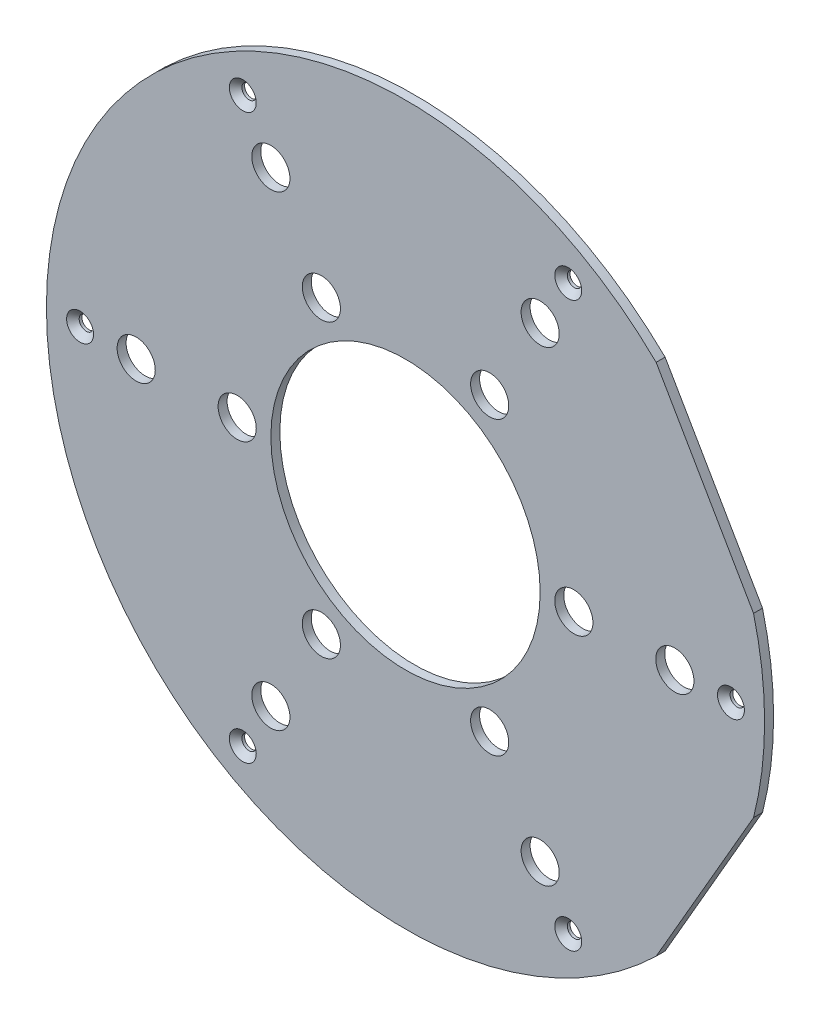
ISO-10303-21;
HEADER;
FILE_DESCRIPTION(('STEP AP214'),'2;1');
FILE_NAME('part.step','',(''),(''),'','','');
FILE_SCHEMA(('AUTOMOTIVE_DESIGN { 1 0 10303 214 1 1 1 1 }'));
ENDSEC;
DATA;
#1=APPLICATION_CONTEXT('core data for automotive mechanical design processes');
#2=APPLICATION_PROTOCOL_DEFINITION('international standard','automotive_design',2000,#1);
#3=PRODUCT_CONTEXT('',#1,'mechanical');
#4=PRODUCT('Part','Part','',(#3));
#5=PRODUCT_RELATED_PRODUCT_CATEGORY('part','',(#4));
#6=PRODUCT_DEFINITION_FORMATION('','',#4);
#7=PRODUCT_DEFINITION_CONTEXT('part definition',#1,'design');
#8=PRODUCT_DEFINITION('design','',#6,#7);
#9=PRODUCT_DEFINITION_SHAPE('','',#8);
#10=(LENGTH_UNIT() NAMED_UNIT(*) SI_UNIT(.MILLI.,.METRE.));
#11=(NAMED_UNIT(*) PLANE_ANGLE_UNIT() SI_UNIT($,.RADIAN.));
#12=(NAMED_UNIT(*) SI_UNIT($,.STERADIAN.) SOLID_ANGLE_UNIT());
#13=UNCERTAINTY_MEASURE_WITH_UNIT(LENGTH_MEASURE(1.E-05),#10,'distance_accuracy_value','');
#14=(GEOMETRIC_REPRESENTATION_CONTEXT(3) GLOBAL_UNCERTAINTY_ASSIGNED_CONTEXT((#13)) GLOBAL_UNIT_ASSIGNED_CONTEXT((#10,
#11,#12)) REPRESENTATION_CONTEXT('',''));
#15=CARTESIAN_POINT('',(0.,0.,0.));
#16=DIRECTION('',(0.,0.,1.));
#17=DIRECTION('',(1.,0.,0.));
#18=AXIS2_PLACEMENT_3D('',#15,#16,#17);
#19=CARTESIAN_POINT('',(36.25,-62.7868417743718,1.3));
#20=DIRECTION('',(0.,0.,1.));
#21=DIRECTION('',(1.,0.,0.));
#22=AXIS2_PLACEMENT_3D('',#19,#20,#21);
#23=CONICAL_SURFACE('',#22,2.3,0.7853981625);
#24=CARTESIAN_POINT('',(36.25,-62.7868417743718,2.));
#25=DIRECTION('',(0.,0.,-1.));
#26=DIRECTION('',(1.,0.,0.));
#27=AXIS2_PLACEMENT_3D('',#24,#25,#26);
#28=CIRCLE('',#27,3.);
#29=CARTESIAN_POINT('',(39.25,-62.7868417743718,2.));
#30=VERTEX_POINT('',#29);
#31=EDGE_CURVE('E545',#30,#30,#28,.T.);
#32=ORIENTED_EDGE('',*,*,#31,.F.);
#33=EDGE_LOOP('',(#32));
#34=FACE_BOUND('',#33,.T.);
#35=CARTESIAN_POINT('',(36.25,-62.7868417743718,0.599999999999994));
#36=DIRECTION('',(0.,0.,1.));
#37=DIRECTION('',(1.,0.,0.));
#38=AXIS2_PLACEMENT_3D('',#35,#36,#37);
#39=CIRCLE('',#38,1.6);
#40=CARTESIAN_POINT('',(37.8499999999999,-62.7868417743718,0.599999999999994));
#41=VERTEX_POINT('',#40);
#42=EDGE_CURVE('E11',#41,#41,#39,.T.);
#43=ORIENTED_EDGE('',*,*,#42,.F.);
#44=EDGE_LOOP('',(#43));
#45=FACE_BOUND('',#44,.T.);
#46=ADVANCED_FACE('F17',(#34,#45),#23,.F.);
#47=CARTESIAN_POINT('',(36.25,-62.7868417743718,-224.283008641833));
#48=DIRECTION('',(0.,0.,1.));
#49=DIRECTION('',(1.,0.,0.));
#50=AXIS2_PLACEMENT_3D('',#47,#48,#49);
#51=CYLINDRICAL_SURFACE('',#50,1.6);
#52=CARTESIAN_POINT('',(36.25,-62.7868417743718,0.));
#53=DIRECTION('',(0.,0.,1.));
#54=DIRECTION('',(1.,0.,0.));
#55=AXIS2_PLACEMENT_3D('',#52,#53,#54);
#56=CIRCLE('',#55,1.6);
#57=CARTESIAN_POINT('',(37.8499999999999,-62.7868417743718,0.));
#58=VERTEX_POINT('',#57);
#59=EDGE_CURVE('E81',#58,#58,#56,.T.);
#60=ORIENTED_EDGE('',*,*,#59,.F.);
#61=EDGE_LOOP('',(#60));
#62=FACE_BOUND('',#61,.T.);
#63=ORIENTED_EDGE('',*,*,#42,.T.);
#64=EDGE_LOOP('',(#63));
#65=FACE_BOUND('',#64,.T.);
#66=ADVANCED_FACE('F254',(#62,#65),#51,.F.);
#67=CARTESIAN_POINT('',(-36.25,-62.7868417743718,1.3));
#68=DIRECTION('',(0.,0.,1.));
#69=DIRECTION('',(1.,0.,0.));
#70=AXIS2_PLACEMENT_3D('',#67,#68,#69);
#71=CONICAL_SURFACE('',#70,2.3,0.7853981625);
#72=CARTESIAN_POINT('',(-36.25,-62.7868417743718,2.));
#73=DIRECTION('',(0.,0.,-1.));
#74=DIRECTION('',(1.,0.,0.));
#75=AXIS2_PLACEMENT_3D('',#72,#73,#74);
#76=CIRCLE('',#75,3.);
#77=CARTESIAN_POINT('',(-33.25,-62.7868417743718,2.));
#78=VERTEX_POINT('',#77);
#79=EDGE_CURVE('E587',#78,#78,#76,.T.);
#80=ORIENTED_EDGE('',*,*,#79,.F.);
#81=EDGE_LOOP('',(#80));
#82=FACE_BOUND('',#81,.T.);
#83=CARTESIAN_POINT('',(-36.25,-62.7868417743718,0.599999999999994));
#84=DIRECTION('',(0.,0.,1.));
#85=DIRECTION('',(1.,0.,0.));
#86=AXIS2_PLACEMENT_3D('',#83,#84,#85);
#87=CIRCLE('',#86,1.6);
#88=CARTESIAN_POINT('',(-34.65,-62.7868417743718,0.599999999999994));
#89=VERTEX_POINT('',#88);
#90=EDGE_CURVE('E27',#89,#89,#87,.T.);
#91=ORIENTED_EDGE('',*,*,#90,.F.);
#92=EDGE_LOOP('',(#91));
#93=FACE_BOUND('',#92,.T.);
#94=ADVANCED_FACE('F260',(#82,#93),#71,.F.);
#95=CARTESIAN_POINT('',(-36.25,-62.7868417743718,-224.283008641833));
#96=DIRECTION('',(0.,0.,1.));
#97=DIRECTION('',(1.,0.,0.));
#98=AXIS2_PLACEMENT_3D('',#95,#96,#97);
#99=CYLINDRICAL_SURFACE('',#98,1.6);
#100=CARTESIAN_POINT('',(-36.25,-62.7868417743718,0.));
#101=DIRECTION('',(0.,0.,1.));
#102=DIRECTION('',(1.,0.,0.));
#103=AXIS2_PLACEMENT_3D('',#100,#101,#102);
#104=CIRCLE('',#103,1.6);
#105=CARTESIAN_POINT('',(-34.65,-62.7868417743718,0.));
#106=VERTEX_POINT('',#105);
#107=EDGE_CURVE('E84',#106,#106,#104,.T.);
#108=ORIENTED_EDGE('',*,*,#107,.F.);
#109=EDGE_LOOP('',(#108));
#110=FACE_BOUND('',#109,.T.);
#111=ORIENTED_EDGE('',*,*,#90,.T.);
#112=EDGE_LOOP('',(#111));
#113=FACE_BOUND('',#112,.T.);
#114=ADVANCED_FACE('F268',(#110,#113),#99,.F.);
#115=CARTESIAN_POINT('',(-72.5,0.,1.3));
#116=DIRECTION('',(0.,0.,1.));
#117=DIRECTION('',(1.,0.,0.));
#118=AXIS2_PLACEMENT_3D('',#115,#116,#117);
#119=CONICAL_SURFACE('',#118,2.3,0.7853981625);
#120=CARTESIAN_POINT('',(-72.5,0.,2.));
#121=DIRECTION('',(0.,0.,-1.));
#122=DIRECTION('',(1.,0.,0.));
#123=AXIS2_PLACEMENT_3D('',#120,#121,#122);
#124=CIRCLE('',#123,3.);
#125=CARTESIAN_POINT('',(-69.5,0.,2.));
#126=VERTEX_POINT('',#125);
#127=EDGE_CURVE('E580',#126,#126,#124,.T.);
#128=ORIENTED_EDGE('',*,*,#127,.F.);
#129=EDGE_LOOP('',(#128));
#130=FACE_BOUND('',#129,.T.);
#131=CARTESIAN_POINT('',(-72.5,0.,0.599999999999994));
#132=DIRECTION('',(0.,0.,1.));
#133=DIRECTION('',(1.,0.,0.));
#134=AXIS2_PLACEMENT_3D('',#131,#132,#133);
#135=CIRCLE('',#134,1.6);
#136=CARTESIAN_POINT('',(-70.9,0.,0.599999999999994));
#137=VERTEX_POINT('',#136);
#138=EDGE_CURVE('E577',#137,#137,#135,.T.);
#139=ORIENTED_EDGE('',*,*,#138,.F.);
#140=EDGE_LOOP('',(#139));
#141=FACE_BOUND('',#140,.T.);
#142=ADVANCED_FACE('F272',(#130,#141),#119,.F.);
#143=CARTESIAN_POINT('',(-72.5,0.,-224.283008641833));
#144=DIRECTION('',(0.,0.,1.));
#145=DIRECTION('',(1.,0.,0.));
#146=AXIS2_PLACEMENT_3D('',#143,#144,#145);
#147=CYLINDRICAL_SURFACE('',#146,1.6);
#148=CARTESIAN_POINT('',(-72.5,0.,0.));
#149=DIRECTION('',(0.,0.,1.));
#150=DIRECTION('',(1.,0.,0.));
#151=AXIS2_PLACEMENT_3D('',#148,#149,#150);
#152=CIRCLE('',#151,1.6);
#153=CARTESIAN_POINT('',(-70.9,0.,0.));
#154=VERTEX_POINT('',#153);
#155=EDGE_CURVE('E574',#154,#154,#152,.T.);
#156=ORIENTED_EDGE('',*,*,#155,.F.);
#157=EDGE_LOOP('',(#156));
#158=FACE_BOUND('',#157,.T.);
#159=ORIENTED_EDGE('',*,*,#138,.T.);
#160=EDGE_LOOP('',(#159));
#161=FACE_BOUND('',#160,.T.);
#162=ADVANCED_FACE('F276',(#158,#161),#147,.F.);
#163=CARTESIAN_POINT('',(-36.25,62.7868417743718,1.3));
#164=DIRECTION('',(0.,0.,1.));
#165=DIRECTION('',(1.,0.,0.));
#166=AXIS2_PLACEMENT_3D('',#163,#164,#165);
#167=CONICAL_SURFACE('',#166,2.3,0.7853981625);
#168=CARTESIAN_POINT('',(-36.25,62.7868417743718,2.));
#169=DIRECTION('',(0.,0.,-1.));
#170=DIRECTION('',(1.,0.,0.));
#171=AXIS2_PLACEMENT_3D('',#168,#169,#170);
#172=CIRCLE('',#171,3.);
#173=CARTESIAN_POINT('',(-33.25,62.7868417743718,2.));
#174=VERTEX_POINT('',#173);
#175=EDGE_CURVE('E571',#174,#174,#172,.T.);
#176=ORIENTED_EDGE('',*,*,#175,.F.);
#177=EDGE_LOOP('',(#176));
#178=FACE_BOUND('',#177,.T.);
#179=CARTESIAN_POINT('',(-36.25,62.7868417743718,0.599999999999994));
#180=DIRECTION('',(0.,0.,1.));
#181=DIRECTION('',(1.,0.,0.));
#182=AXIS2_PLACEMENT_3D('',#179,#180,#181);
#183=CIRCLE('',#182,1.6);
#184=CARTESIAN_POINT('',(-34.65,62.7868417743718,0.599999999999994));
#185=VERTEX_POINT('',#184);
#186=EDGE_CURVE('E568',#185,#185,#183,.T.);
#187=ORIENTED_EDGE('',*,*,#186,.F.);
#188=EDGE_LOOP('',(#187));
#189=FACE_BOUND('',#188,.T.);
#190=ADVANCED_FACE('F280',(#178,#189),#167,.F.);
#191=CARTESIAN_POINT('',(-36.25,62.7868417743718,-224.283008641833));
#192=DIRECTION('',(0.,0.,1.));
#193=DIRECTION('',(1.,0.,0.));
#194=AXIS2_PLACEMENT_3D('',#191,#192,#193);
#195=CYLINDRICAL_SURFACE('',#194,1.6);
#196=CARTESIAN_POINT('',(-36.25,62.7868417743718,0.));
#197=DIRECTION('',(0.,0.,1.));
#198=DIRECTION('',(1.,0.,0.));
#199=AXIS2_PLACEMENT_3D('',#196,#197,#198);
#200=CIRCLE('',#199,1.6);
#201=CARTESIAN_POINT('',(-34.65,62.7868417743718,0.));
#202=VERTEX_POINT('',#201);
#203=EDGE_CURVE('E565',#202,#202,#200,.T.);
#204=ORIENTED_EDGE('',*,*,#203,.F.);
#205=EDGE_LOOP('',(#204));
#206=FACE_BOUND('',#205,.T.);
#207=ORIENTED_EDGE('',*,*,#186,.T.);
#208=EDGE_LOOP('',(#207));
#209=FACE_BOUND('',#208,.T.);
#210=ADVANCED_FACE('F284',(#206,#209),#195,.F.);
#211=CARTESIAN_POINT('',(36.25,62.7868417743718,1.3));
#212=DIRECTION('',(0.,0.,1.));
#213=DIRECTION('',(1.,0.,0.));
#214=AXIS2_PLACEMENT_3D('',#211,#212,#213);
#215=CONICAL_SURFACE('',#214,2.3,0.7853981625);
#216=CARTESIAN_POINT('',(36.25,62.7868417743718,2.));
#217=DIRECTION('',(0.,0.,-1.));
#218=DIRECTION('',(1.,0.,0.));
#219=AXIS2_PLACEMENT_3D('',#216,#217,#218);
#220=CIRCLE('',#219,3.);
#221=CARTESIAN_POINT('',(39.25,62.7868417743718,2.));
#222=VERTEX_POINT('',#221);
#223=EDGE_CURVE('E562',#222,#222,#220,.T.);
#224=ORIENTED_EDGE('',*,*,#223,.F.);
#225=EDGE_LOOP('',(#224));
#226=FACE_BOUND('',#225,.T.);
#227=CARTESIAN_POINT('',(36.25,62.7868417743718,0.599999999999994));
#228=DIRECTION('',(0.,0.,1.));
#229=DIRECTION('',(1.,0.,0.));
#230=AXIS2_PLACEMENT_3D('',#227,#228,#229);
#231=CIRCLE('',#230,1.6);
#232=CARTESIAN_POINT('',(37.85,62.7868417743718,0.599999999999994));
#233=VERTEX_POINT('',#232);
#234=EDGE_CURVE('E559',#233,#233,#231,.T.);
#235=ORIENTED_EDGE('',*,*,#234,.F.);
#236=EDGE_LOOP('',(#235));
#237=FACE_BOUND('',#236,.T.);
#238=ADVANCED_FACE('F288',(#226,#237),#215,.F.);
#239=CARTESIAN_POINT('',(36.25,62.7868417743718,-224.283008641833));
#240=DIRECTION('',(0.,0.,1.));
#241=DIRECTION('',(1.,0.,0.));
#242=AXIS2_PLACEMENT_3D('',#239,#240,#241);
#243=CYLINDRICAL_SURFACE('',#242,1.6);
#244=CARTESIAN_POINT('',(36.25,62.7868417743718,0.));
#245=DIRECTION('',(0.,0.,1.));
#246=DIRECTION('',(1.,0.,0.));
#247=AXIS2_PLACEMENT_3D('',#244,#245,#246);
#248=CIRCLE('',#247,1.6);
#249=CARTESIAN_POINT('',(37.85,62.7868417743718,0.));
#250=VERTEX_POINT('',#249);
#251=EDGE_CURVE('E556',#250,#250,#248,.T.);
#252=ORIENTED_EDGE('',*,*,#251,.F.);
#253=EDGE_LOOP('',(#252));
#254=FACE_BOUND('',#253,.T.);
#255=ORIENTED_EDGE('',*,*,#234,.T.);
#256=EDGE_LOOP('',(#255));
#257=FACE_BOUND('',#256,.T.);
#258=ADVANCED_FACE('F292',(#254,#257),#243,.F.);
#259=CARTESIAN_POINT('',(72.5,0.,1.3));
#260=DIRECTION('',(0.,0.,1.));
#261=DIRECTION('',(1.,0.,0.));
#262=AXIS2_PLACEMENT_3D('',#259,#260,#261);
#263=CONICAL_SURFACE('',#262,2.3,0.7853981625);
#264=CARTESIAN_POINT('',(72.5,0.,2.));
#265=DIRECTION('',(0.,0.,-1.));
#266=DIRECTION('',(1.,0.,0.));
#267=AXIS2_PLACEMENT_3D('',#264,#265,#266);
#268=CIRCLE('',#267,3.);
#269=CARTESIAN_POINT('',(75.5,0.,2.));
#270=VERTEX_POINT('',#269);
#271=EDGE_CURVE('E137',#270,#270,#268,.T.);
#272=ORIENTED_EDGE('',*,*,#271,.F.);
#273=EDGE_LOOP('',(#272));
#274=FACE_BOUND('',#273,.T.);
#275=CARTESIAN_POINT('',(72.5,0.,0.599999999999994));
#276=DIRECTION('',(0.,0.,1.));
#277=DIRECTION('',(1.,0.,0.));
#278=AXIS2_PLACEMENT_3D('',#275,#276,#277);
#279=CIRCLE('',#278,1.6);
#280=CARTESIAN_POINT('',(74.1,0.,0.599999999999994));
#281=VERTEX_POINT('',#280);
#282=EDGE_CURVE('E551',#281,#281,#279,.T.);
#283=ORIENTED_EDGE('',*,*,#282,.F.);
#284=EDGE_LOOP('',(#283));
#285=FACE_BOUND('',#284,.T.);
#286=ADVANCED_FACE('F296',(#274,#285),#263,.F.);
#287=CARTESIAN_POINT('',(72.5,0.,-224.283008641833));
#288=DIRECTION('',(0.,0.,1.));
#289=DIRECTION('',(1.,0.,0.));
#290=AXIS2_PLACEMENT_3D('',#287,#288,#289);
#291=CYLINDRICAL_SURFACE('',#290,1.6);
#292=CARTESIAN_POINT('',(72.5,0.,0.));
#293=DIRECTION('',(0.,0.,1.));
#294=DIRECTION('',(1.,0.,0.));
#295=AXIS2_PLACEMENT_3D('',#292,#293,#294);
#296=CIRCLE('',#295,1.6);
#297=CARTESIAN_POINT('',(74.1,0.,0.));
#298=VERTEX_POINT('',#297);
#299=EDGE_CURVE('E91',#298,#298,#296,.T.);
#300=ORIENTED_EDGE('',*,*,#299,.F.);
#301=EDGE_LOOP('',(#300));
#302=FACE_BOUND('',#301,.T.);
#303=ORIENTED_EDGE('',*,*,#282,.T.);
#304=EDGE_LOOP('',(#303));
#305=FACE_BOUND('',#304,.T.);
#306=ADVANCED_FACE('F300',(#302,#305),#291,.F.);
#307=CARTESIAN_POINT('',(66.6839560914018,-38.5,2.));
#308=DIRECTION('',(-0.866025403784439,0.5,0.));
#309=DIRECTION('',(0.,0.,1.));
#310=AXIS2_PLACEMENT_3D('',#307,#308,#309);
#311=PLANE('',#310);
#312=DIRECTION('',(0.,0.,-1.));
#313=VECTOR('',#312,1.);
#314=CARTESIAN_POINT('',(77.5352232985071,-19.7050538707874,2.));
#315=LINE('',#314,#313);
#316=CARTESIAN_POINT('',(77.5352232985071,-19.7050538707875,2.));
#317=VERTEX_POINT('',#316);
#318=CARTESIAN_POINT('',(77.5352232985071,-19.7050538707874,0.));
#319=VERTEX_POINT('',#318);
#320=EDGE_CURVE('E67',#317,#319,#315,.T.);
#321=ORIENTED_EDGE('',*,*,#320,.F.);
#322=DIRECTION('',(0.5,0.866025403784439,0.));
#323=VECTOR('',#322,1.);
#324=CARTESIAN_POINT('',(55.8326888842964,-57.2949461292125,2.));
#325=LINE('',#324,#323);
#326=CARTESIAN_POINT('',(55.8326888842964,-57.2949461292125,2.));
#327=VERTEX_POINT('',#326);
#328=EDGE_CURVE('E36',#327,#317,#325,.T.);
#329=ORIENTED_EDGE('',*,*,#328,.F.);
#330=DIRECTION('',(0.,0.,1.));
#331=VECTOR('',#330,1.);
#332=CARTESIAN_POINT('',(55.8326888842964,-57.2949461292125,0.));
#333=LINE('',#332,#331);
#334=CARTESIAN_POINT('',(55.8326888842964,-57.2949461292125,0.));
#335=VERTEX_POINT('',#334);
#336=EDGE_CURVE('E128',#335,#327,#333,.T.);
#337=ORIENTED_EDGE('',*,*,#336,.F.);
#338=DIRECTION('',(-0.5,-0.866025403784439,0.));
#339=VECTOR('',#338,1.);
#340=CARTESIAN_POINT('',(77.5352232985072,-19.7050538707874,0.));
#341=LINE('',#340,#339);
#342=EDGE_CURVE('E550',#319,#335,#341,.T.);
#343=ORIENTED_EDGE('',*,*,#342,.F.);
#344=EDGE_LOOP('',(#321,#329,#337,#343));
#345=FACE_BOUND('',#344,.T.);
#346=ADVANCED_FACE('F304',(#345),#311,.F.);
#347=CARTESIAN_POINT('',(66.6839560914018,38.5,2.));
#348=DIRECTION('',(-0.866025403784439,-0.5,0.));
#349=DIRECTION('',(0.,0.,1.));
#350=AXIS2_PLACEMENT_3D('',#347,#348,#349);
#351=PLANE('',#350);
#352=DIRECTION('',(0.,0.,-1.));
#353=VECTOR('',#352,1.);
#354=CARTESIAN_POINT('',(55.8326888842964,57.2949461292125,2.));
#355=LINE('',#354,#353);
#356=CARTESIAN_POINT('',(55.8326888842964,57.2949461292125,2.));
#357=VERTEX_POINT('',#356);
#358=CARTESIAN_POINT('',(55.8326888842964,57.2949461292125,0.));
#359=VERTEX_POINT('',#358);
#360=EDGE_CURVE('E132',#357,#359,#355,.T.);
#361=ORIENTED_EDGE('',*,*,#360,.F.);
#362=DIRECTION('',(-0.5,0.866025403784439,0.));
#363=VECTOR('',#362,1.);
#364=CARTESIAN_POINT('',(77.5352232985071,19.7050538707875,2.));
#365=LINE('',#364,#363);
#366=CARTESIAN_POINT('',(77.5352232985071,19.7050538707875,2.));
#367=VERTEX_POINT('',#366);
#368=EDGE_CURVE('E56',#367,#357,#365,.T.);
#369=ORIENTED_EDGE('',*,*,#368,.F.);
#370=DIRECTION('',(0.,0.,1.));
#371=VECTOR('',#370,1.);
#372=CARTESIAN_POINT('',(77.5352232985071,19.7050538707875,0.));
#373=LINE('',#372,#371);
#374=CARTESIAN_POINT('',(77.5352232985071,19.7050538707875,0.));
#375=VERTEX_POINT('',#374);
#376=EDGE_CURVE('E59',#375,#367,#373,.T.);
#377=ORIENTED_EDGE('',*,*,#376,.F.);
#378=DIRECTION('',(0.5,-0.866025403784439,0.));
#379=VECTOR('',#378,1.);
#380=CARTESIAN_POINT('',(55.8326888842964,57.2949461292125,0.));
#381=LINE('',#380,#379);
#382=EDGE_CURVE('E62',#359,#375,#381,.T.);
#383=ORIENTED_EDGE('',*,*,#382,.F.);
#384=EDGE_LOOP('',(#361,#369,#377,#383));
#385=FACE_BOUND('',#384,.T.);
#386=ADVANCED_FACE('F61',(#385),#351,.F.);
#387=CARTESIAN_POINT('',(0.,0.,0.));
#388=DIRECTION('',(0.,0.,-1.));
#389=DIRECTION('',(-1.,0.,0.));
#390=AXIS2_PLACEMENT_3D('',#387,#388,#389);
#391=PLANE('',#390);
#392=ORIENTED_EDGE('',*,*,#342,.T.);
#393=CARTESIAN_POINT('',(0.,0.,0.));
#394=DIRECTION('',(0.,0.,-1.));
#395=DIRECTION('',(-1.,0.,0.));
#396=AXIS2_PLACEMENT_3D('',#393,#394,#395);
#397=CIRCLE('',#396,80.);
#398=EDGE_CURVE('E77',#335,#359,#397,.T.);
#399=ORIENTED_EDGE('',*,*,#398,.T.);
#400=ORIENTED_EDGE('',*,*,#382,.T.);
#401=CARTESIAN_POINT('',(0.,0.,0.));
#402=DIRECTION('',(0.,0.,-1.));
#403=DIRECTION('',(-1.,0.,0.));
#404=AXIS2_PLACEMENT_3D('',#401,#402,#403);
#405=CIRCLE('',#404,80.);
#406=EDGE_CURVE('E75',#375,#319,#405,.T.);
#407=ORIENTED_EDGE('',*,*,#406,.T.);
#408=EDGE_LOOP('',(#392,#399,#400,#407));
#409=FACE_BOUND('',#408,.T.);
#410=ORIENTED_EDGE('',*,*,#59,.T.);
#411=EDGE_LOOP('',(#410));
#412=FACE_BOUND('',#411,.T.);
#413=ORIENTED_EDGE('',*,*,#107,.T.);
#414=EDGE_LOOP('',(#413));
#415=FACE_BOUND('',#414,.T.);
#416=ORIENTED_EDGE('',*,*,#155,.T.);
#417=EDGE_LOOP('',(#416));
#418=FACE_BOUND('',#417,.T.);
#419=ORIENTED_EDGE('',*,*,#203,.T.);
#420=EDGE_LOOP('',(#419));
#421=FACE_BOUND('',#420,.T.);
#422=ORIENTED_EDGE('',*,*,#251,.T.);
#423=EDGE_LOOP('',(#422));
#424=FACE_BOUND('',#423,.T.);
#425=ORIENTED_EDGE('',*,*,#299,.T.);
#426=EDGE_LOOP('',(#425));
#427=FACE_BOUND('',#426,.T.);
#428=CARTESIAN_POINT('',(0.,0.,0.));
#429=DIRECTION('',(0.,0.,1.));
#430=DIRECTION('',(-1.,0.,0.));
#431=AXIS2_PLACEMENT_3D('',#428,#429,#430);
#432=CIRCLE('',#431,30.);
#433=CARTESIAN_POINT('',(-30.,0.,0.));
#434=VERTEX_POINT('',#433);
#435=EDGE_CURVE('E88',#434,#434,#432,.T.);
#436=ORIENTED_EDGE('',*,*,#435,.T.);
#437=EDGE_LOOP('',(#436));
#438=FACE_BOUND('',#437,.T.);
#439=CARTESIAN_POINT('',(37.5,0.,0.));
#440=DIRECTION('',(0.,0.,1.));
#441=DIRECTION('',(1.,0.,0.));
#442=AXIS2_PLACEMENT_3D('',#439,#440,#441);
#443=CIRCLE('',#442,4.25);
#444=CARTESIAN_POINT('',(41.75,0.,0.));
#445=VERTEX_POINT('',#444);
#446=EDGE_CURVE('E92',#445,#445,#443,.T.);
#447=ORIENTED_EDGE('',*,*,#446,.T.);
#448=EDGE_LOOP('',(#447));
#449=FACE_BOUND('',#448,.T.);
#450=CARTESIAN_POINT('',(60.,0.,0.));
#451=DIRECTION('',(0.,0.,1.));
#452=DIRECTION('',(1.,0.,0.));
#453=AXIS2_PLACEMENT_3D('',#450,#451,#452);
#454=CIRCLE('',#453,4.25);
#455=CARTESIAN_POINT('',(64.25,0.,0.));
#456=VERTEX_POINT('',#455);
#457=EDGE_CURVE('E95',#456,#456,#454,.T.);
#458=ORIENTED_EDGE('',*,*,#457,.T.);
#459=EDGE_LOOP('',(#458));
#460=FACE_BOUND('',#459,.T.);
#461=CARTESIAN_POINT('',(18.75,32.4759526419164,0.));
#462=DIRECTION('',(0.,0.,1.));
#463=DIRECTION('',(1.,0.,0.));
#464=AXIS2_PLACEMENT_3D('',#461,#462,#463);
#465=CIRCLE('',#464,4.25);
#466=CARTESIAN_POINT('',(23.,32.4759526419164,0.));
#467=VERTEX_POINT('',#466);
#468=EDGE_CURVE('E98',#467,#467,#465,.T.);
#469=ORIENTED_EDGE('',*,*,#468,.T.);
#470=EDGE_LOOP('',(#469));
#471=FACE_BOUND('',#470,.T.);
#472=CARTESIAN_POINT('',(30.,51.9615242270663,0.));
#473=DIRECTION('',(0.,0.,1.));
#474=DIRECTION('',(1.,0.,0.));
#475=AXIS2_PLACEMENT_3D('',#472,#473,#474);
#476=CIRCLE('',#475,4.25);
#477=CARTESIAN_POINT('',(34.25,51.9615242270663,0.));
#478=VERTEX_POINT('',#477);
#479=EDGE_CURVE('E101',#478,#478,#476,.T.);
#480=ORIENTED_EDGE('',*,*,#479,.T.);
#481=EDGE_LOOP('',(#480));
#482=FACE_BOUND('',#481,.T.);
#483=CARTESIAN_POINT('',(-18.75,32.4759526419165,0.));
#484=DIRECTION('',(0.,0.,1.));
#485=DIRECTION('',(1.,0.,0.));
#486=AXIS2_PLACEMENT_3D('',#483,#484,#485);
#487=CIRCLE('',#486,4.25);
#488=CARTESIAN_POINT('',(-14.5,32.4759526419165,0.));
#489=VERTEX_POINT('',#488);
#490=EDGE_CURVE('E104',#489,#489,#487,.T.);
#491=ORIENTED_EDGE('',*,*,#490,.T.);
#492=EDGE_LOOP('',(#491));
#493=FACE_BOUND('',#492,.T.);
#494=CARTESIAN_POINT('',(-30.,51.9615242270663,0.));
#495=DIRECTION('',(0.,0.,1.));
#496=DIRECTION('',(1.,0.,0.));
#497=AXIS2_PLACEMENT_3D('',#494,#495,#496);
#498=CIRCLE('',#497,4.25);
#499=CARTESIAN_POINT('',(-25.75,51.9615242270663,0.));
#500=VERTEX_POINT('',#499);
#501=EDGE_CURVE('E107',#500,#500,#498,.T.);
#502=ORIENTED_EDGE('',*,*,#501,.T.);
#503=EDGE_LOOP('',(#502));
#504=FACE_BOUND('',#503,.T.);
#505=CARTESIAN_POINT('',(-37.5,0.,0.));
#506=DIRECTION('',(0.,0.,1.));
#507=DIRECTION('',(1.,0.,0.));
#508=AXIS2_PLACEMENT_3D('',#505,#506,#507);
#509=CIRCLE('',#508,4.25);
#510=CARTESIAN_POINT('',(-33.25,0.,0.));
#511=VERTEX_POINT('',#510);
#512=EDGE_CURVE('E110',#511,#511,#509,.T.);
#513=ORIENTED_EDGE('',*,*,#512,.T.);
#514=EDGE_LOOP('',(#513));
#515=FACE_BOUND('',#514,.T.);
#516=CARTESIAN_POINT('',(-60.,0.,0.));
#517=DIRECTION('',(0.,0.,1.));
#518=DIRECTION('',(1.,0.,0.));
#519=AXIS2_PLACEMENT_3D('',#516,#517,#518);
#520=CIRCLE('',#519,4.25);
#521=CARTESIAN_POINT('',(-55.75,0.,0.));
#522=VERTEX_POINT('',#521);
#523=EDGE_CURVE('E113',#522,#522,#520,.T.);
#524=ORIENTED_EDGE('',*,*,#523,.T.);
#525=EDGE_LOOP('',(#524));
#526=FACE_BOUND('',#525,.T.);
#527=CARTESIAN_POINT('',(-18.75,-32.4759526419164,0.));
#528=DIRECTION('',(0.,0.,1.));
#529=DIRECTION('',(1.,0.,0.));
#530=AXIS2_PLACEMENT_3D('',#527,#528,#529);
#531=CIRCLE('',#530,4.25);
#532=CARTESIAN_POINT('',(-14.5,-32.4759526419164,0.));
#533=VERTEX_POINT('',#532);
#534=EDGE_CURVE('E116',#533,#533,#531,.T.);
#535=ORIENTED_EDGE('',*,*,#534,.T.);
#536=EDGE_LOOP('',(#535));
#537=FACE_BOUND('',#536,.T.);
#538=CARTESIAN_POINT('',(-30.,-51.9615242270663,0.));
#539=DIRECTION('',(0.,0.,1.));
#540=DIRECTION('',(1.,0.,0.));
#541=AXIS2_PLACEMENT_3D('',#538,#539,#540);
#542=CIRCLE('',#541,4.25);
#543=CARTESIAN_POINT('',(-25.75,-51.9615242270663,0.));
#544=VERTEX_POINT('',#543);
#545=EDGE_CURVE('E119',#544,#544,#542,.T.);
#546=ORIENTED_EDGE('',*,*,#545,.T.);
#547=EDGE_LOOP('',(#546));
#548=FACE_BOUND('',#547,.T.);
#549=CARTESIAN_POINT('',(18.75,-32.4759526419165,0.));
#550=DIRECTION('',(0.,0.,1.));
#551=DIRECTION('',(1.,0.,0.));
#552=AXIS2_PLACEMENT_3D('',#549,#550,#551);
#553=CIRCLE('',#552,4.25);
#554=CARTESIAN_POINT('',(23.,-32.4759526419165,0.));
#555=VERTEX_POINT('',#554);
#556=EDGE_CURVE('E122',#555,#555,#553,.T.);
#557=ORIENTED_EDGE('',*,*,#556,.T.);
#558=EDGE_LOOP('',(#557));
#559=FACE_BOUND('',#558,.T.);
#560=CARTESIAN_POINT('',(30.,-51.9615242270663,0.));
#561=DIRECTION('',(0.,0.,1.));
#562=DIRECTION('',(1.,0.,0.));
#563=AXIS2_PLACEMENT_3D('',#560,#561,#562);
#564=CIRCLE('',#563,4.25);
#565=CARTESIAN_POINT('',(34.25,-51.9615242270663,0.));
#566=VERTEX_POINT('',#565);
#567=EDGE_CURVE('E125',#566,#566,#564,.T.);
#568=ORIENTED_EDGE('',*,*,#567,.T.);
#569=EDGE_LOOP('',(#568));
#570=FACE_BOUND('',#569,.T.);
#571=ADVANCED_FACE('F73',(#409,#412,#415,#418,#421,#424,#427,#438,#449,#460,#471,#482,#493,#504,
#515,#526,#537,#548,#559,#570),#391,.T.);
#572=CARTESIAN_POINT('',(0.,0.,0.));
#573=DIRECTION('',(0.,0.,1.));
#574=DIRECTION('',(-1.,0.,0.));
#575=AXIS2_PLACEMENT_3D('',#572,#573,#574);
#576=CYLINDRICAL_SURFACE('',#575,80.);
#577=ORIENTED_EDGE('',*,*,#336,.T.);
#578=CARTESIAN_POINT('',(0.,0.,2.));
#579=DIRECTION('',(0.,0.,-1.));
#580=DIRECTION('',(-1.,0.,0.));
#581=AXIS2_PLACEMENT_3D('',#578,#579,#580);
#582=CIRCLE('',#581,80.);
#583=EDGE_CURVE('E129',#327,#357,#582,.T.);
#584=ORIENTED_EDGE('',*,*,#583,.T.);
#585=ORIENTED_EDGE('',*,*,#360,.T.);
#586=ORIENTED_EDGE('',*,*,#398,.F.);
#587=EDGE_LOOP('',(#577,#584,#585,#586));
#588=FACE_BOUND('',#587,.T.);
#589=ADVANCED_FACE('F183',(#588),#576,.T.);
#590=CARTESIAN_POINT('',(0.,0.,0.));
#591=DIRECTION('',(0.,0.,1.));
#592=DIRECTION('',(-1.,0.,0.));
#593=AXIS2_PLACEMENT_3D('',#590,#591,#592);
#594=CYLINDRICAL_SURFACE('',#593,80.);
#595=ORIENTED_EDGE('',*,*,#320,.T.);
#596=ORIENTED_EDGE('',*,*,#406,.F.);
#597=ORIENTED_EDGE('',*,*,#376,.T.);
#598=CARTESIAN_POINT('',(0.,0.,2.));
#599=DIRECTION('',(0.,0.,-1.));
#600=DIRECTION('',(-1.,0.,0.));
#601=AXIS2_PLACEMENT_3D('',#598,#599,#600);
#602=CIRCLE('',#601,80.);
#603=EDGE_CURVE('E68',#367,#317,#602,.T.);
#604=ORIENTED_EDGE('',*,*,#603,.T.);
#605=EDGE_LOOP('',(#595,#596,#597,#604));
#606=FACE_BOUND('',#605,.T.);
#607=ADVANCED_FACE('F79',(#606),#594,.T.);
#608=CARTESIAN_POINT('',(30.,-51.9615242270663,-224.283008641833));
#609=DIRECTION('',(0.,0.,1.));
#610=DIRECTION('',(1.,0.,0.));
#611=AXIS2_PLACEMENT_3D('',#608,#609,#610);
#612=CYLINDRICAL_SURFACE('',#611,4.25);
#613=ORIENTED_EDGE('',*,*,#567,.F.);
#614=EDGE_LOOP('',(#613));
#615=FACE_BOUND('',#614,.T.);
#616=CARTESIAN_POINT('',(30.,-51.9615242270663,1.99999999999999));
#617=DIRECTION('',(0.,0.,-1.));
#618=DIRECTION('',(1.,0.,0.));
#619=AXIS2_PLACEMENT_3D('',#616,#617,#618);
#620=CIRCLE('',#619,4.25);
#621=CARTESIAN_POINT('',(34.25,-51.9615242270663,1.99999999999999));
#622=VERTEX_POINT('',#621);
#623=EDGE_CURVE('E134',#622,#622,#620,.T.);
#624=ORIENTED_EDGE('',*,*,#623,.F.);
#625=EDGE_LOOP('',(#624));
#626=FACE_BOUND('',#625,.T.);
#627=ADVANCED_FACE('F209',(#615,#626),#612,.F.);
#628=CARTESIAN_POINT('',(18.75,-32.4759526419165,-224.283008641833));
#629=DIRECTION('',(0.,0.,1.));
#630=DIRECTION('',(1.,0.,0.));
#631=AXIS2_PLACEMENT_3D('',#628,#629,#630);
#632=CYLINDRICAL_SURFACE('',#631,4.25);
#633=ORIENTED_EDGE('',*,*,#556,.F.);
#634=EDGE_LOOP('',(#633));
#635=FACE_BOUND('',#634,.T.);
#636=CARTESIAN_POINT('',(18.75,-32.4759526419165,1.99999999999999));
#637=DIRECTION('',(0.,0.,-1.));
#638=DIRECTION('',(1.,0.,0.));
#639=AXIS2_PLACEMENT_3D('',#636,#637,#638);
#640=CIRCLE('',#639,4.25);
#641=CARTESIAN_POINT('',(23.,-32.4759526419165,1.99999999999999));
#642=VERTEX_POINT('',#641);
#643=EDGE_CURVE('E138',#642,#642,#640,.T.);
#644=ORIENTED_EDGE('',*,*,#643,.F.);
#645=EDGE_LOOP('',(#644));
#646=FACE_BOUND('',#645,.T.);
#647=ADVANCED_FACE('F212',(#635,#646),#632,.F.);
#648=CARTESIAN_POINT('',(-30.,-51.9615242270663,-224.283008641833));
#649=DIRECTION('',(0.,0.,1.));
#650=DIRECTION('',(1.,0.,0.));
#651=AXIS2_PLACEMENT_3D('',#648,#649,#650);
#652=CYLINDRICAL_SURFACE('',#651,4.25);
#653=ORIENTED_EDGE('',*,*,#545,.F.);
#654=EDGE_LOOP('',(#653));
#655=FACE_BOUND('',#654,.T.);
#656=CARTESIAN_POINT('',(-30.,-51.9615242270663,1.99999999999999));
#657=DIRECTION('',(0.,0.,-1.));
#658=DIRECTION('',(1.,0.,0.));
#659=AXIS2_PLACEMENT_3D('',#656,#657,#658);
#660=CIRCLE('',#659,4.25);
#661=CARTESIAN_POINT('',(-25.75,-51.9615242270663,1.99999999999999));
#662=VERTEX_POINT('',#661);
#663=EDGE_CURVE('E141',#662,#662,#660,.T.);
#664=ORIENTED_EDGE('',*,*,#663,.F.);
#665=EDGE_LOOP('',(#664));
#666=FACE_BOUND('',#665,.T.);
#667=ADVANCED_FACE('F318',(#655,#666),#652,.F.);
#668=CARTESIAN_POINT('',(-18.75,-32.4759526419164,-224.283008641833));
#669=DIRECTION('',(0.,0.,1.));
#670=DIRECTION('',(1.,0.,0.));
#671=AXIS2_PLACEMENT_3D('',#668,#669,#670);
#672=CYLINDRICAL_SURFACE('',#671,4.25);
#673=ORIENTED_EDGE('',*,*,#534,.F.);
#674=EDGE_LOOP('',(#673));
#675=FACE_BOUND('',#674,.T.);
#676=CARTESIAN_POINT('',(-18.75,-32.4759526419164,1.99999999999999));
#677=DIRECTION('',(0.,0.,-1.));
#678=DIRECTION('',(1.,0.,0.));
#679=AXIS2_PLACEMENT_3D('',#676,#677,#678);
#680=CIRCLE('',#679,4.25);
#681=CARTESIAN_POINT('',(-14.5,-32.4759526419164,1.99999999999999));
#682=VERTEX_POINT('',#681);
#683=EDGE_CURVE('E144',#682,#682,#680,.T.);
#684=ORIENTED_EDGE('',*,*,#683,.F.);
#685=EDGE_LOOP('',(#684));
#686=FACE_BOUND('',#685,.T.);
#687=ADVANCED_FACE('F322',(#675,#686),#672,.F.);
#688=CARTESIAN_POINT('',(-60.,0.,-224.283008641833));
#689=DIRECTION('',(0.,0.,1.));
#690=DIRECTION('',(1.,0.,0.));
#691=AXIS2_PLACEMENT_3D('',#688,#689,#690);
#692=CYLINDRICAL_SURFACE('',#691,4.25);
#693=ORIENTED_EDGE('',*,*,#523,.F.);
#694=EDGE_LOOP('',(#693));
#695=FACE_BOUND('',#694,.T.);
#696=CARTESIAN_POINT('',(-60.,0.,1.99999999999999));
#697=DIRECTION('',(0.,0.,-1.));
#698=DIRECTION('',(1.,0.,0.));
#699=AXIS2_PLACEMENT_3D('',#696,#697,#698);
#700=CIRCLE('',#699,4.25);
#701=CARTESIAN_POINT('',(-55.75,0.,1.99999999999999));
#702=VERTEX_POINT('',#701);
#703=EDGE_CURVE('E147',#702,#702,#700,.T.);
#704=ORIENTED_EDGE('',*,*,#703,.F.);
#705=EDGE_LOOP('',(#704));
#706=FACE_BOUND('',#705,.T.);
#707=ADVANCED_FACE('F326',(#695,#706),#692,.F.);
#708=CARTESIAN_POINT('',(-37.5,0.,-224.283008641833));
#709=DIRECTION('',(0.,0.,1.));
#710=DIRECTION('',(1.,0.,0.));
#711=AXIS2_PLACEMENT_3D('',#708,#709,#710);
#712=CYLINDRICAL_SURFACE('',#711,4.25);
#713=ORIENTED_EDGE('',*,*,#512,.F.);
#714=EDGE_LOOP('',(#713));
#715=FACE_BOUND('',#714,.T.);
#716=CARTESIAN_POINT('',(-37.5,0.,1.99999999999999));
#717=DIRECTION('',(0.,0.,-1.));
#718=DIRECTION('',(1.,0.,0.));
#719=AXIS2_PLACEMENT_3D('',#716,#717,#718);
#720=CIRCLE('',#719,4.25);
#721=CARTESIAN_POINT('',(-33.25,0.,1.99999999999999));
#722=VERTEX_POINT('',#721);
#723=EDGE_CURVE('E150',#722,#722,#720,.T.);
#724=ORIENTED_EDGE('',*,*,#723,.F.);
#725=EDGE_LOOP('',(#724));
#726=FACE_BOUND('',#725,.T.);
#727=ADVANCED_FACE('F330',(#715,#726),#712,.F.);
#728=CARTESIAN_POINT('',(-30.,51.9615242270663,-224.283008641833));
#729=DIRECTION('',(0.,0.,1.));
#730=DIRECTION('',(1.,0.,0.));
#731=AXIS2_PLACEMENT_3D('',#728,#729,#730);
#732=CYLINDRICAL_SURFACE('',#731,4.25);
#733=ORIENTED_EDGE('',*,*,#501,.F.);
#734=EDGE_LOOP('',(#733));
#735=FACE_BOUND('',#734,.T.);
#736=CARTESIAN_POINT('',(-30.,51.9615242270663,1.99999999999999));
#737=DIRECTION('',(0.,0.,-1.));
#738=DIRECTION('',(1.,0.,0.));
#739=AXIS2_PLACEMENT_3D('',#736,#737,#738);
#740=CIRCLE('',#739,4.25);
#741=CARTESIAN_POINT('',(-25.75,51.9615242270663,1.99999999999999));
#742=VERTEX_POINT('',#741);
#743=EDGE_CURVE('E153',#742,#742,#740,.T.);
#744=ORIENTED_EDGE('',*,*,#743,.F.);
#745=EDGE_LOOP('',(#744));
#746=FACE_BOUND('',#745,.T.);
#747=ADVANCED_FACE('F334',(#735,#746),#732,.F.);
#748=CARTESIAN_POINT('',(-18.75,32.4759526419165,-224.283008641833));
#749=DIRECTION('',(0.,0.,1.));
#750=DIRECTION('',(1.,0.,0.));
#751=AXIS2_PLACEMENT_3D('',#748,#749,#750);
#752=CYLINDRICAL_SURFACE('',#751,4.25);
#753=ORIENTED_EDGE('',*,*,#490,.F.);
#754=EDGE_LOOP('',(#753));
#755=FACE_BOUND('',#754,.T.);
#756=CARTESIAN_POINT('',(-18.75,32.4759526419165,1.99999999999999));
#757=DIRECTION('',(0.,0.,-1.));
#758=DIRECTION('',(1.,0.,0.));
#759=AXIS2_PLACEMENT_3D('',#756,#757,#758);
#760=CIRCLE('',#759,4.25);
#761=CARTESIAN_POINT('',(-14.5,32.4759526419165,1.99999999999999));
#762=VERTEX_POINT('',#761);
#763=EDGE_CURVE('E156',#762,#762,#760,.T.);
#764=ORIENTED_EDGE('',*,*,#763,.F.);
#765=EDGE_LOOP('',(#764));
#766=FACE_BOUND('',#765,.T.);
#767=ADVANCED_FACE('F338',(#755,#766),#752,.F.);
#768=CARTESIAN_POINT('',(30.,51.9615242270663,-224.283008641833));
#769=DIRECTION('',(0.,0.,1.));
#770=DIRECTION('',(1.,0.,0.));
#771=AXIS2_PLACEMENT_3D('',#768,#769,#770);
#772=CYLINDRICAL_SURFACE('',#771,4.25);
#773=ORIENTED_EDGE('',*,*,#479,.F.);
#774=EDGE_LOOP('',(#773));
#775=FACE_BOUND('',#774,.T.);
#776=CARTESIAN_POINT('',(30.,51.9615242270663,1.99999999999999));
#777=DIRECTION('',(0.,0.,-1.));
#778=DIRECTION('',(1.,0.,0.));
#779=AXIS2_PLACEMENT_3D('',#776,#777,#778);
#780=CIRCLE('',#779,4.25);
#781=CARTESIAN_POINT('',(34.25,51.9615242270663,1.99999999999999));
#782=VERTEX_POINT('',#781);
#783=EDGE_CURVE('E159',#782,#782,#780,.T.);
#784=ORIENTED_EDGE('',*,*,#783,.F.);
#785=EDGE_LOOP('',(#784));
#786=FACE_BOUND('',#785,.T.);
#787=ADVANCED_FACE('F250',(#775,#786),#772,.F.);
#788=CARTESIAN_POINT('',(18.75,32.4759526419164,-224.283008641833));
#789=DIRECTION('',(0.,0.,1.));
#790=DIRECTION('',(1.,0.,0.));
#791=AXIS2_PLACEMENT_3D('',#788,#789,#790);
#792=CYLINDRICAL_SURFACE('',#791,4.25);
#793=ORIENTED_EDGE('',*,*,#468,.F.);
#794=EDGE_LOOP('',(#793));
#795=FACE_BOUND('',#794,.T.);
#796=CARTESIAN_POINT('',(18.75,32.4759526419164,1.99999999999999));
#797=DIRECTION('',(0.,0.,-1.));
#798=DIRECTION('',(1.,0.,0.));
#799=AXIS2_PLACEMENT_3D('',#796,#797,#798);
#800=CIRCLE('',#799,4.25);
#801=CARTESIAN_POINT('',(23.,32.4759526419164,1.99999999999999));
#802=VERTEX_POINT('',#801);
#803=EDGE_CURVE('E162',#802,#802,#800,.T.);
#804=ORIENTED_EDGE('',*,*,#803,.F.);
#805=EDGE_LOOP('',(#804));
#806=FACE_BOUND('',#805,.T.);
#807=ADVANCED_FACE('F240',(#795,#806),#792,.F.);
#808=CARTESIAN_POINT('',(60.,0.,-224.283008641833));
#809=DIRECTION('',(0.,0.,1.));
#810=DIRECTION('',(1.,0.,0.));
#811=AXIS2_PLACEMENT_3D('',#808,#809,#810);
#812=CYLINDRICAL_SURFACE('',#811,4.25);
#813=ORIENTED_EDGE('',*,*,#457,.F.);
#814=EDGE_LOOP('',(#813));
#815=FACE_BOUND('',#814,.T.);
#816=CARTESIAN_POINT('',(60.,0.,1.99999999999999));
#817=DIRECTION('',(0.,0.,-1.));
#818=DIRECTION('',(1.,0.,0.));
#819=AXIS2_PLACEMENT_3D('',#816,#817,#818);
#820=CIRCLE('',#819,4.25);
#821=CARTESIAN_POINT('',(64.25,0.,1.99999999999999));
#822=VERTEX_POINT('',#821);
#823=EDGE_CURVE('E165',#822,#822,#820,.T.);
#824=ORIENTED_EDGE('',*,*,#823,.F.);
#825=EDGE_LOOP('',(#824));
#826=FACE_BOUND('',#825,.T.);
#827=ADVANCED_FACE('F238',(#815,#826),#812,.F.);
#828=CARTESIAN_POINT('',(37.5,0.,-224.283008641833));
#829=DIRECTION('',(0.,0.,1.));
#830=DIRECTION('',(1.,0.,0.));
#831=AXIS2_PLACEMENT_3D('',#828,#829,#830);
#832=CYLINDRICAL_SURFACE('',#831,4.25);
#833=ORIENTED_EDGE('',*,*,#446,.F.);
#834=EDGE_LOOP('',(#833));
#835=FACE_BOUND('',#834,.T.);
#836=CARTESIAN_POINT('',(37.5,0.,1.99999999999999));
#837=DIRECTION('',(0.,0.,-1.));
#838=DIRECTION('',(1.,0.,0.));
#839=AXIS2_PLACEMENT_3D('',#836,#837,#838);
#840=CIRCLE('',#839,4.25);
#841=CARTESIAN_POINT('',(41.75,0.,1.99999999999999));
#842=VERTEX_POINT('',#841);
#843=EDGE_CURVE('E167',#842,#842,#840,.T.);
#844=ORIENTED_EDGE('',*,*,#843,.F.);
#845=EDGE_LOOP('',(#844));
#846=FACE_BOUND('',#845,.T.);
#847=ADVANCED_FACE('F178',(#835,#846),#832,.F.);
#848=CARTESIAN_POINT('',(0.,0.,0.));
#849=DIRECTION('',(0.,0.,1.));
#850=DIRECTION('',(-1.,0.,0.));
#851=AXIS2_PLACEMENT_3D('',#848,#849,#850);
#852=CYLINDRICAL_SURFACE('',#851,30.);
#853=CARTESIAN_POINT('',(0.,0.,2.));
#854=DIRECTION('',(0.,0.,-1.));
#855=DIRECTION('',(-1.,0.,0.));
#856=AXIS2_PLACEMENT_3D('',#853,#854,#855);
#857=CIRCLE('',#856,30.);
#858=CARTESIAN_POINT('',(-30.,0.,2.));
#859=VERTEX_POINT('',#858);
#860=EDGE_CURVE('E21',#859,#859,#857,.T.);
#861=ORIENTED_EDGE('',*,*,#860,.F.);
#862=EDGE_LOOP('',(#861));
#863=FACE_BOUND('',#862,.T.);
#864=ORIENTED_EDGE('',*,*,#435,.F.);
#865=EDGE_LOOP('',(#864));
#866=FACE_BOUND('',#865,.T.);
#867=ADVANCED_FACE('F175',(#863,#866),#852,.F.);
#868=CARTESIAN_POINT('',(0.,0.,2.));
#869=DIRECTION('',(0.,0.,-1.));
#870=DIRECTION('',(-1.,0.,0.));
#871=AXIS2_PLACEMENT_3D('',#868,#869,#870);
#872=PLANE('',#871);
#873=ORIENTED_EDGE('',*,*,#328,.T.);
#874=ORIENTED_EDGE('',*,*,#603,.F.);
#875=ORIENTED_EDGE('',*,*,#368,.T.);
#876=ORIENTED_EDGE('',*,*,#583,.F.);
#877=EDGE_LOOP('',(#873,#874,#875,#876));
#878=FACE_BOUND('',#877,.T.);
#879=ORIENTED_EDGE('',*,*,#31,.T.);
#880=EDGE_LOOP('',(#879));
#881=FACE_BOUND('',#880,.T.);
#882=ORIENTED_EDGE('',*,*,#79,.T.);
#883=EDGE_LOOP('',(#882));
#884=FACE_BOUND('',#883,.T.);
#885=ORIENTED_EDGE('',*,*,#127,.T.);
#886=EDGE_LOOP('',(#885));
#887=FACE_BOUND('',#886,.T.);
#888=ORIENTED_EDGE('',*,*,#175,.T.);
#889=EDGE_LOOP('',(#888));
#890=FACE_BOUND('',#889,.T.);
#891=ORIENTED_EDGE('',*,*,#223,.T.);
#892=EDGE_LOOP('',(#891));
#893=FACE_BOUND('',#892,.T.);
#894=ORIENTED_EDGE('',*,*,#271,.T.);
#895=EDGE_LOOP('',(#894));
#896=FACE_BOUND('',#895,.T.);
#897=ORIENTED_EDGE('',*,*,#623,.T.);
#898=EDGE_LOOP('',(#897));
#899=FACE_BOUND('',#898,.T.);
#900=ORIENTED_EDGE('',*,*,#643,.T.);
#901=EDGE_LOOP('',(#900));
#902=FACE_BOUND('',#901,.T.);
#903=ORIENTED_EDGE('',*,*,#663,.T.);
#904=EDGE_LOOP('',(#903));
#905=FACE_BOUND('',#904,.T.);
#906=ORIENTED_EDGE('',*,*,#683,.T.);
#907=EDGE_LOOP('',(#906));
#908=FACE_BOUND('',#907,.T.);
#909=ORIENTED_EDGE('',*,*,#703,.T.);
#910=EDGE_LOOP('',(#909));
#911=FACE_BOUND('',#910,.T.);
#912=ORIENTED_EDGE('',*,*,#723,.T.);
#913=EDGE_LOOP('',(#912));
#914=FACE_BOUND('',#913,.T.);
#915=ORIENTED_EDGE('',*,*,#743,.T.);
#916=EDGE_LOOP('',(#915));
#917=FACE_BOUND('',#916,.T.);
#918=ORIENTED_EDGE('',*,*,#763,.T.);
#919=EDGE_LOOP('',(#918));
#920=FACE_BOUND('',#919,.T.);
#921=ORIENTED_EDGE('',*,*,#783,.T.);
#922=EDGE_LOOP('',(#921));
#923=FACE_BOUND('',#922,.T.);
#924=ORIENTED_EDGE('',*,*,#803,.T.);
#925=EDGE_LOOP('',(#924));
#926=FACE_BOUND('',#925,.T.);
#927=ORIENTED_EDGE('',*,*,#823,.T.);
#928=EDGE_LOOP('',(#927));
#929=FACE_BOUND('',#928,.T.);
#930=ORIENTED_EDGE('',*,*,#843,.T.);
#931=EDGE_LOOP('',(#930));
#932=FACE_BOUND('',#931,.T.);
#933=ORIENTED_EDGE('',*,*,#860,.T.);
#934=EDGE_LOOP('',(#933));
#935=FACE_BOUND('',#934,.T.);
#936=ADVANCED_FACE('F19',(#878,#881,#884,#887,#890,#893,#896,#899,#902,#905,#908,#911,#914,#917,
#920,#923,#926,#929,#932,#935),#872,.F.);
#937=CLOSED_SHELL('',(#46,#66,#94,#114,#142,#162,#190,#210,#238,#258,#286,#306,#346,#386,#571,
#589,#607,#627,#647,#667,#687,#707,#727,#747,#767,#787,#807,#827,#847,#867,#936));
#938=MANIFOLD_SOLID_BREP('B1',#937);
#939=ADVANCED_BREP_SHAPE_REPRESENTATION('',(#18,#938),#14);
#940=SHAPE_DEFINITION_REPRESENTATION(#9,#939);
ENDSEC;
END-ISO-10303-21;
